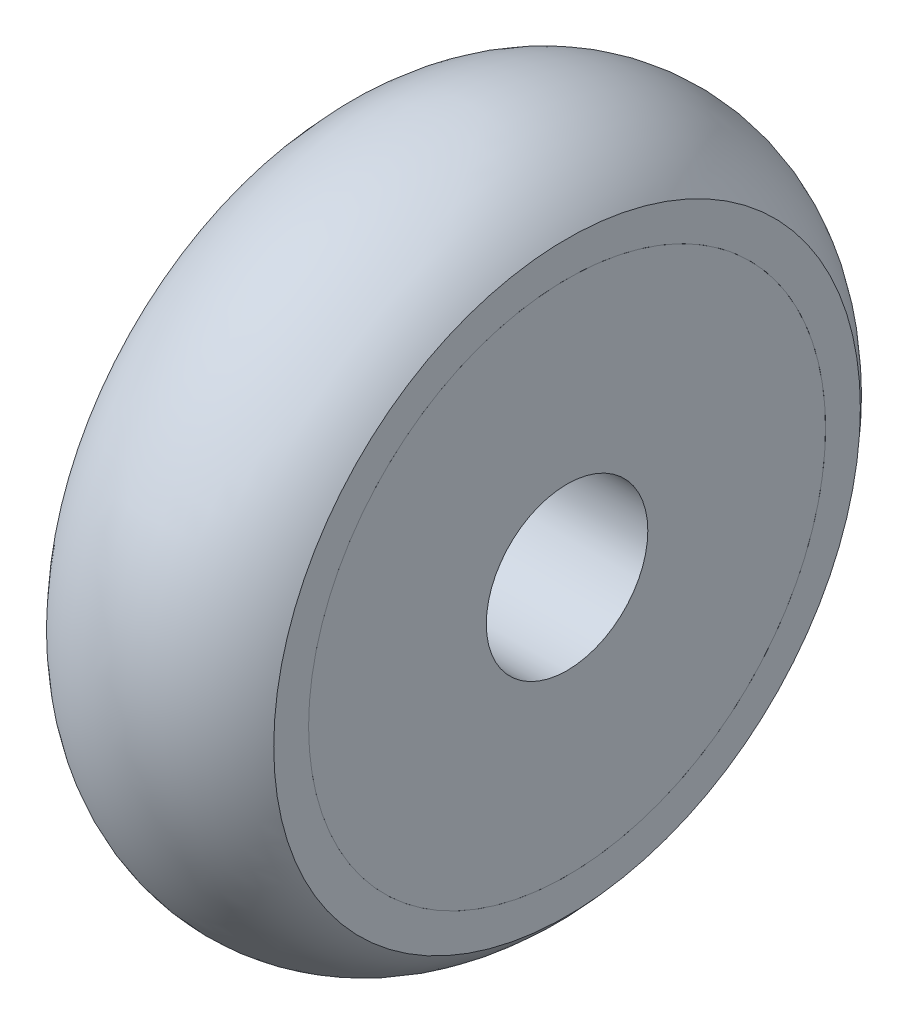
ISO-10303-21;
HEADER;
FILE_DESCRIPTION(('STEP AP214'),'2;1');
FILE_NAME('part.step','',(''),(''),'','','');
FILE_SCHEMA(('AUTOMOTIVE_DESIGN { 1 0 10303 214 1 1 1 1 }'));
ENDSEC;
DATA;
#1=APPLICATION_CONTEXT('core data for automotive mechanical design processes');
#2=APPLICATION_PROTOCOL_DEFINITION('international standard','automotive_design',2000,#1);
#3=PRODUCT_CONTEXT('',#1,'mechanical');
#4=PRODUCT('Part','Part','',(#3));
#5=PRODUCT_RELATED_PRODUCT_CATEGORY('part','',(#4));
#6=PRODUCT_DEFINITION_FORMATION('','',#4);
#7=PRODUCT_DEFINITION_CONTEXT('part definition',#1,'design');
#8=PRODUCT_DEFINITION('design','',#6,#7);
#9=PRODUCT_DEFINITION_SHAPE('','',#8);
#10=(LENGTH_UNIT() NAMED_UNIT(*) SI_UNIT(.MILLI.,.METRE.));
#11=(NAMED_UNIT(*) PLANE_ANGLE_UNIT() SI_UNIT($,.RADIAN.));
#12=(NAMED_UNIT(*) SI_UNIT($,.STERADIAN.) SOLID_ANGLE_UNIT());
#13=UNCERTAINTY_MEASURE_WITH_UNIT(LENGTH_MEASURE(1.E-05),#10,'distance_accuracy_value','');
#14=(GEOMETRIC_REPRESENTATION_CONTEXT(3) GLOBAL_UNCERTAINTY_ASSIGNED_CONTEXT((#13)) GLOBAL_UNIT_ASSIGNED_CONTEXT((#10,
#11,#12)) REPRESENTATION_CONTEXT('',''));
#15=CARTESIAN_POINT('',(0.,0.,0.));
#16=DIRECTION('',(0.,0.,1.));
#17=DIRECTION('',(1.,0.,0.));
#18=AXIS2_PLACEMENT_3D('',#15,#16,#17);
#19=CARTESIAN_POINT('',(3.5,0.,0.));
#20=DIRECTION('',(-1.,0.,0.));
#21=DIRECTION('',(0.,0.,1.));
#22=AXIS2_PLACEMENT_3D('',#19,#20,#21);
#23=PLANE('',#22);
#24=CARTESIAN_POINT('',(3.5,0.,0.));
#25=DIRECTION('',(-1.,0.,0.));
#26=DIRECTION('',(0.,0.,1.));
#27=AXIS2_PLACEMENT_3D('',#24,#25,#26);
#28=CIRCLE('',#27,8.);
#29=CARTESIAN_POINT('',(3.5,0.,8.));
#30=VERTEX_POINT('',#29);
#31=EDGE_CURVE('E49',#30,#30,#28,.T.);
#32=ORIENTED_EDGE('',*,*,#31,.F.);
#33=EDGE_LOOP('',(#32));
#34=FACE_BOUND('',#33,.T.);
#35=CARTESIAN_POINT('',(3.5,0.,0.));
#36=DIRECTION('',(-1.,0.,0.));
#37=DIRECTION('',(0.,0.,1.));
#38=AXIS2_PLACEMENT_3D('',#35,#36,#37);
#39=CIRCLE('',#38,2.5);
#40=CARTESIAN_POINT('',(3.5,0.,2.5));
#41=VERTEX_POINT('',#40);
#42=EDGE_CURVE('E58',#41,#41,#39,.T.);
#43=ORIENTED_EDGE('',*,*,#42,.T.);
#44=EDGE_LOOP('',(#43));
#45=FACE_BOUND('',#44,.T.);
#46=ADVANCED_FACE('F42',(#34,#45),#23,.F.);
#47=CARTESIAN_POINT('',(-26.1274169979695,0.,0.));
#48=DIRECTION('',(1.,0.,0.));
#49=DIRECTION('',(0.,0.,-1.));
#50=AXIS2_PLACEMENT_3D('',#47,#48,#49);
#51=CYLINDRICAL_SURFACE('',#50,8.);
#52=CARTESIAN_POINT('',(-3.5,0.,0.));
#53=DIRECTION('',(1.,0.,0.));
#54=DIRECTION('',(0.,0.,-1.));
#55=AXIS2_PLACEMENT_3D('',#52,#53,#54);
#56=CIRCLE('',#55,8.);
#57=CARTESIAN_POINT('',(-3.5,0.,-8.));
#58=VERTEX_POINT('',#57);
#59=EDGE_CURVE('E53',#58,#58,#56,.T.);
#60=ORIENTED_EDGE('',*,*,#59,.T.);
#61=EDGE_LOOP('',(#60));
#62=FACE_BOUND('',#61,.T.);
#63=ORIENTED_EDGE('',*,*,#31,.T.);
#64=EDGE_LOOP('',(#63));
#65=FACE_BOUND('',#64,.T.);
#66=ADVANCED_FACE('F66',(#62,#65),#51,.T.);
#67=CARTESIAN_POINT('',(-26.1274169979695,0.,0.));
#68=DIRECTION('',(1.,0.,0.));
#69=DIRECTION('',(0.,0.,-1.));
#70=AXIS2_PLACEMENT_3D('',#67,#68,#69);
#71=CYLINDRICAL_SURFACE('',#70,2.5);
#72=CARTESIAN_POINT('',(-3.5,0.,0.));
#73=DIRECTION('',(1.,0.,0.));
#74=DIRECTION('',(0.,0.,-1.));
#75=AXIS2_PLACEMENT_3D('',#72,#73,#74);
#76=CIRCLE('',#75,2.5);
#77=CARTESIAN_POINT('',(-3.5,0.,-2.5));
#78=VERTEX_POINT('',#77);
#79=EDGE_CURVE('E11',#78,#78,#76,.T.);
#80=ORIENTED_EDGE('',*,*,#79,.F.);
#81=EDGE_LOOP('',(#80));
#82=FACE_BOUND('',#81,.T.);
#83=ORIENTED_EDGE('',*,*,#42,.F.);
#84=EDGE_LOOP('',(#83));
#85=FACE_BOUND('',#84,.T.);
#86=ADVANCED_FACE('F64',(#82,#85),#71,.F.);
#87=CARTESIAN_POINT('',(-3.5,8.,0.));
#88=DIRECTION('',(1.,0.,0.));
#89=DIRECTION('',(0.,0.,-1.));
#90=AXIS2_PLACEMENT_3D('',#87,#88,#89);
#91=PLANE('',#90);
#92=ORIENTED_EDGE('',*,*,#79,.T.);
#93=EDGE_LOOP('',(#92));
#94=FACE_BOUND('',#93,.T.);
#95=ORIENTED_EDGE('',*,*,#59,.F.);
#96=EDGE_LOOP('',(#95));
#97=FACE_BOUND('',#96,.T.);
#98=ADVANCED_FACE('F44',(#94,#97),#91,.F.);
#99=CLOSED_SHELL('',(#46,#66,#86,#98));
#100=MANIFOLD_SOLID_BREP('B2',#99);
#101=CARTESIAN_POINT('',(-3.5,8.,0.));
#102=DIRECTION('',(1.,0.,0.));
#103=DIRECTION('',(0.,0.,-1.));
#104=AXIS2_PLACEMENT_3D('',#101,#102,#103);
#105=PLANE('',#104);
#106=CARTESIAN_POINT('',(-3.5,0.,0.));
#107=DIRECTION('',(-1.,0.,0.));
#108=DIRECTION('',(0.,0.,1.));
#109=AXIS2_PLACEMENT_3D('',#106,#107,#108);
#110=CIRCLE('',#109,8.);
#111=CARTESIAN_POINT('',(-3.5,0.,8.));
#112=VERTEX_POINT('',#111);
#113=EDGE_CURVE('E117',#112,#112,#110,.T.);
#114=ORIENTED_EDGE('',*,*,#113,.F.);
#115=EDGE_LOOP('',(#114));
#116=FACE_BOUND('',#115,.T.);
#117=CARTESIAN_POINT('',(-3.5,0.,0.));
#118=DIRECTION('',(-1.,0.,0.));
#119=DIRECTION('',(0.,0.,1.));
#120=AXIS2_PLACEMENT_3D('',#117,#118,#119);
#121=CIRCLE('',#120,9.07842712474619);
#122=CARTESIAN_POINT('',(-3.5,0.,9.07842712474619));
#123=VERTEX_POINT('',#122);
#124=EDGE_CURVE('E41',#123,#123,#121,.T.);
#125=ORIENTED_EDGE('',*,*,#124,.T.);
#126=EDGE_LOOP('',(#125));
#127=FACE_BOUND('',#126,.T.);
#128=ADVANCED_FACE('F103',(#116,#127),#105,.F.);
#129=CARTESIAN_POINT('',(0.,0.,0.));
#130=DIRECTION('',(-1.,0.,0.));
#131=DIRECTION('',(0.,0.,1.));
#132=AXIS2_PLACEMENT_3D('',#129,#130,#131);
#133=TOROIDAL_SURFACE('',#132,6.25,4.5);
#134=ORIENTED_EDGE('',*,*,#124,.F.);
#135=EDGE_LOOP('',(#134));
#136=FACE_BOUND('',#135,.T.);
#137=CARTESIAN_POINT('',(3.5,0.,0.));
#138=DIRECTION('',(-1.,0.,0.));
#139=DIRECTION('',(0.,0.,1.));
#140=AXIS2_PLACEMENT_3D('',#137,#138,#139);
#141=CIRCLE('',#140,9.07842712474619);
#142=CARTESIAN_POINT('',(3.5,0.,9.07842712474619));
#143=VERTEX_POINT('',#142);
#144=EDGE_CURVE('E109',#143,#143,#141,.T.);
#145=ORIENTED_EDGE('',*,*,#144,.T.);
#146=EDGE_LOOP('',(#145));
#147=FACE_BOUND('',#146,.T.);
#148=ADVANCED_FACE('F126',(#136,#147),#133,.T.);
#149=CARTESIAN_POINT('',(3.5,8.,0.));
#150=DIRECTION('',(-1.,0.,0.));
#151=DIRECTION('',(0.,0.,1.));
#152=AXIS2_PLACEMENT_3D('',#149,#150,#151);
#153=PLANE('',#152);
#154=ORIENTED_EDGE('',*,*,#144,.F.);
#155=EDGE_LOOP('',(#154));
#156=FACE_BOUND('',#155,.T.);
#157=CARTESIAN_POINT('',(3.5,0.,0.));
#158=DIRECTION('',(-1.,0.,0.));
#159=DIRECTION('',(0.,0.,1.));
#160=AXIS2_PLACEMENT_3D('',#157,#158,#159);
#161=CIRCLE('',#160,8.);
#162=CARTESIAN_POINT('',(3.5,0.,8.));
#163=VERTEX_POINT('',#162);
#164=EDGE_CURVE('E113',#163,#163,#161,.T.);
#165=ORIENTED_EDGE('',*,*,#164,.T.);
#166=EDGE_LOOP('',(#165));
#167=FACE_BOUND('',#166,.T.);
#168=ADVANCED_FACE('F130',(#156,#167),#153,.F.);
#169=CARTESIAN_POINT('',(-4.91728059958731,0.,0.));
#170=DIRECTION('',(-1.,0.,0.));
#171=DIRECTION('',(0.,0.,1.));
#172=AXIS2_PLACEMENT_3D('',#169,#170,#171);
#173=CYLINDRICAL_SURFACE('',#172,8.);
#174=ORIENTED_EDGE('',*,*,#164,.F.);
#175=EDGE_LOOP('',(#174));
#176=FACE_BOUND('',#175,.T.);
#177=ORIENTED_EDGE('',*,*,#113,.T.);
#178=EDGE_LOOP('',(#177));
#179=FACE_BOUND('',#178,.T.);
#180=ADVANCED_FACE('F123',(#176,#179),#173,.F.);
#181=CLOSED_SHELL('',(#128,#148,#168,#180));
#182=MANIFOLD_SOLID_BREP('B6',#181);
#183=ADVANCED_BREP_SHAPE_REPRESENTATION('',(#18,#100,#182),#14);
#184=SHAPE_DEFINITION_REPRESENTATION(#9,#183);
ENDSEC;
END-ISO-10303-21;
